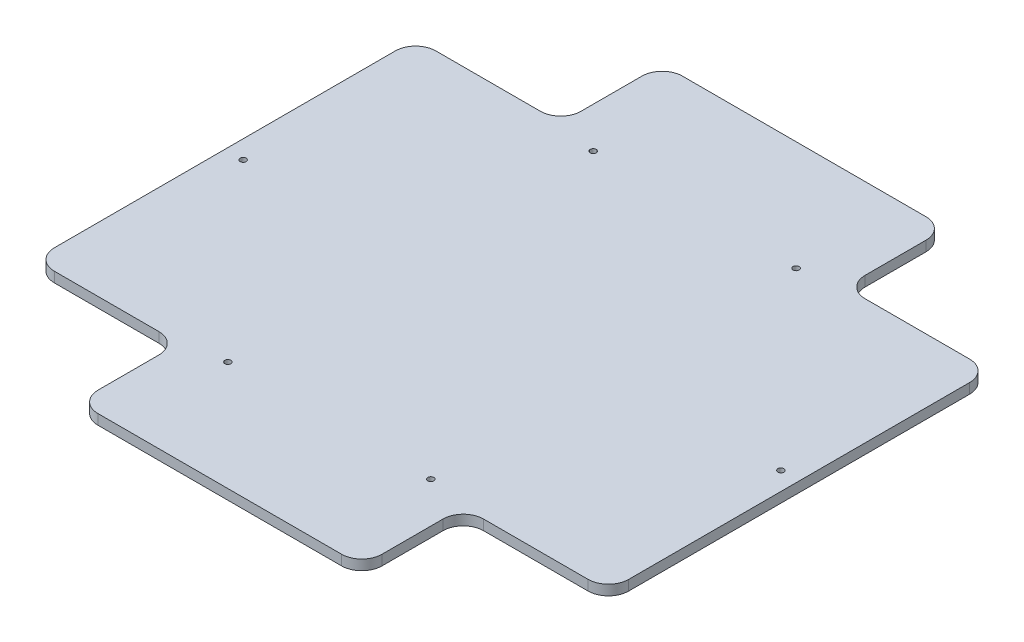
ISO-10303-21;
HEADER;
FILE_DESCRIPTION(('STEP AP214'),'2;1');
FILE_NAME('part.step','',(''),(''),'','','');
FILE_SCHEMA(('AUTOMOTIVE_DESIGN { 1 0 10303 214 1 1 1 1 }'));
ENDSEC;
DATA;
#1=APPLICATION_CONTEXT('core data for automotive mechanical design processes');
#2=APPLICATION_PROTOCOL_DEFINITION('international standard','automotive_design',2000,#1);
#3=PRODUCT_CONTEXT('',#1,'mechanical');
#4=PRODUCT('Part','Part','',(#3));
#5=PRODUCT_RELATED_PRODUCT_CATEGORY('part','',(#4));
#6=PRODUCT_DEFINITION_FORMATION('','',#4);
#7=PRODUCT_DEFINITION_CONTEXT('part definition',#1,'design');
#8=PRODUCT_DEFINITION('design','',#6,#7);
#9=PRODUCT_DEFINITION_SHAPE('','',#8);
#10=(LENGTH_UNIT() NAMED_UNIT(*) SI_UNIT(.MILLI.,.METRE.));
#11=(NAMED_UNIT(*) PLANE_ANGLE_UNIT() SI_UNIT($,.RADIAN.));
#12=(NAMED_UNIT(*) SI_UNIT($,.STERADIAN.) SOLID_ANGLE_UNIT());
#13=UNCERTAINTY_MEASURE_WITH_UNIT(LENGTH_MEASURE(1.E-05),#10,'distance_accuracy_value','');
#14=(GEOMETRIC_REPRESENTATION_CONTEXT(3) GLOBAL_UNCERTAINTY_ASSIGNED_CONTEXT((#13)) GLOBAL_UNIT_ASSIGNED_CONTEXT((#10,
#11,#12)) REPRESENTATION_CONTEXT('',''));
#15=CARTESIAN_POINT('',(0.,0.,0.));
#16=DIRECTION('',(0.,0.,1.));
#17=DIRECTION('',(1.,0.,0.));
#18=AXIS2_PLACEMENT_3D('',#15,#16,#17);
#19=CARTESIAN_POINT('',(-141.5,-5.,-94.));
#20=DIRECTION('',(0.,0.,-1.));
#21=DIRECTION('',(-1.,0.,0.));
#22=AXIS2_PLACEMENT_3D('',#19,#20,#21);
#23=PLANE('',#22);
#24=DIRECTION('',(-1.,0.,0.));
#25=VECTOR('',#24,1.);
#26=CARTESIAN_POINT('',(-141.5,5.,-94.));
#27=LINE('',#26,#25);
#28=CARTESIAN_POINT('',(-80.0000000000001,5.,-94.));
#29=VERTEX_POINT('',#28);
#30=CARTESIAN_POINT('',(-131.5,5.,-94.));
#31=VERTEX_POINT('',#30);
#32=EDGE_CURVE('E391',#29,#31,#27,.T.);
#33=ORIENTED_EDGE('',*,*,#32,.F.);
#34=DIRECTION('',(0.,1.,0.));
#35=VECTOR('',#34,1.);
#36=CARTESIAN_POINT('',(-80.0000000000001,0.,-94.));
#37=LINE('',#36,#35);
#38=CARTESIAN_POINT('',(-80.0000000000001,0.,-94.));
#39=VERTEX_POINT('',#38);
#40=EDGE_CURVE('E248',#29,#39,#37,.F.);
#41=ORIENTED_EDGE('',*,*,#40,.T.);
#42=DIRECTION('',(-1.,0.,0.));
#43=VECTOR('',#42,1.);
#44=CARTESIAN_POINT('',(0.,0.,-94.));
#45=LINE('',#44,#43);
#46=CARTESIAN_POINT('',(-131.5,0.,-94.));
#47=VERTEX_POINT('',#46);
#48=EDGE_CURVE('E222',#39,#47,#45,.T.);
#49=ORIENTED_EDGE('',*,*,#48,.T.);
#50=DIRECTION('',(0.,1.,0.));
#51=VECTOR('',#50,1.);
#52=CARTESIAN_POINT('',(-131.5,-5.,-94.));
#53=LINE('',#52,#51);
#54=EDGE_CURVE('E411',#47,#31,#53,.T.);
#55=ORIENTED_EDGE('',*,*,#54,.T.);
#56=EDGE_LOOP('',(#33,#41,#49,#55));
#57=FACE_BOUND('',#56,.T.);
#58=ADVANCED_FACE('F36',(#57),#23,.T.);
#59=CARTESIAN_POINT('',(-141.5,-5.,94.));
#60=DIRECTION('',(0.,0.,1.));
#61=DIRECTION('',(1.,0.,0.));
#62=AXIS2_PLACEMENT_3D('',#59,#60,#61);
#63=PLANE('',#62);
#64=DIRECTION('',(1.,0.,0.));
#65=VECTOR('',#64,1.);
#66=CARTESIAN_POINT('',(0.,0.,94.));
#67=LINE('',#66,#65);
#68=CARTESIAN_POINT('',(-131.5,0.,94.));
#69=VERTEX_POINT('',#68);
#70=CARTESIAN_POINT('',(-80.,0.,94.));
#71=VERTEX_POINT('',#70);
#72=EDGE_CURVE('E223',#69,#71,#67,.T.);
#73=ORIENTED_EDGE('',*,*,#72,.T.);
#74=DIRECTION('',(0.,1.,0.));
#75=VECTOR('',#74,1.);
#76=CARTESIAN_POINT('',(-80.,5.,94.));
#77=LINE('',#76,#75);
#78=CARTESIAN_POINT('',(-80.,5.,94.));
#79=VERTEX_POINT('',#78);
#80=EDGE_CURVE('E277',#71,#79,#77,.T.);
#81=ORIENTED_EDGE('',*,*,#80,.T.);
#82=DIRECTION('',(1.,0.,0.));
#83=VECTOR('',#82,1.);
#84=CARTESIAN_POINT('',(-141.5,5.,94.));
#85=LINE('',#84,#83);
#86=CARTESIAN_POINT('',(-131.5,5.,94.));
#87=VERTEX_POINT('',#86);
#88=EDGE_CURVE('E321',#87,#79,#85,.T.);
#89=ORIENTED_EDGE('',*,*,#88,.F.);
#90=DIRECTION('',(0.,1.,0.));
#91=VECTOR('',#90,1.);
#92=CARTESIAN_POINT('',(-131.5,-5.,94.));
#93=LINE('',#92,#91);
#94=EDGE_CURVE('E230',#87,#69,#93,.F.);
#95=ORIENTED_EDGE('',*,*,#94,.T.);
#96=EDGE_LOOP('',(#73,#81,#89,#95));
#97=FACE_BOUND('',#96,.T.);
#98=ADVANCED_FACE('F482',(#97),#63,.T.);
#99=CARTESIAN_POINT('',(0.,0.,0.));
#100=DIRECTION('',(0.,1.,0.));
#101=DIRECTION('',(0.,0.,1.));
#102=AXIS2_PLACEMENT_3D('',#99,#100,#101);
#103=PLANE('',#102);
#104=CARTESIAN_POINT('',(-50.,0.,90.));
#105=DIRECTION('',(0.,1.,0.));
#106=DIRECTION('',(0.,0.,1.));
#107=AXIS2_PLACEMENT_3D('',#104,#105,#106);
#108=CIRCLE('',#107,1.5);
#109=CARTESIAN_POINT('',(-50.,0.,91.5));
#110=VERTEX_POINT('',#109);
#111=EDGE_CURVE('E360',#110,#110,#108,.F.);
#112=ORIENTED_EDGE('',*,*,#111,.F.);
#113=EDGE_LOOP('',(#112));
#114=FACE_BOUND('',#113,.T.);
#115=CARTESIAN_POINT('',(50.,0.,90.));
#116=DIRECTION('',(0.,1.,0.));
#117=DIRECTION('',(0.,0.,1.));
#118=AXIS2_PLACEMENT_3D('',#115,#116,#117);
#119=CIRCLE('',#118,1.5);
#120=CARTESIAN_POINT('',(50.,0.,91.5));
#121=VERTEX_POINT('',#120);
#122=EDGE_CURVE('E355',#121,#121,#119,.F.);
#123=ORIENTED_EDGE('',*,*,#122,.F.);
#124=EDGE_LOOP('',(#123));
#125=FACE_BOUND('',#124,.T.);
#126=CARTESIAN_POINT('',(-50.,0.,-90.));
#127=DIRECTION('',(0.,1.,0.));
#128=DIRECTION('',(0.,0.,1.));
#129=AXIS2_PLACEMENT_3D('',#126,#127,#128);
#130=CIRCLE('',#129,1.5);
#131=CARTESIAN_POINT('',(-50.,0.,-88.5));
#132=VERTEX_POINT('',#131);
#133=EDGE_CURVE('E372',#132,#132,#130,.T.);
#134=ORIENTED_EDGE('',*,*,#133,.T.);
#135=EDGE_LOOP('',(#134));
#136=FACE_BOUND('',#135,.T.);
#137=CARTESIAN_POINT('',(50.,0.,-90.));
#138=DIRECTION('',(0.,1.,0.));
#139=DIRECTION('',(0.,0.,1.));
#140=AXIS2_PLACEMENT_3D('',#137,#138,#139);
#141=CIRCLE('',#140,1.5);
#142=CARTESIAN_POINT('',(50.,0.,-88.5));
#143=VERTEX_POINT('',#142);
#144=EDGE_CURVE('E367',#143,#143,#141,.T.);
#145=ORIENTED_EDGE('',*,*,#144,.T.);
#146=EDGE_LOOP('',(#145));
#147=FACE_BOUND('',#146,.T.);
#148=CARTESIAN_POINT('',(-132.5,0.,0.));
#149=DIRECTION('',(0.,1.,0.));
#150=DIRECTION('',(0.,0.,1.));
#151=AXIS2_PLACEMENT_3D('',#148,#149,#150);
#152=CIRCLE('',#151,1.5);
#153=CARTESIAN_POINT('',(-132.5,0.,1.5));
#154=VERTEX_POINT('',#153);
#155=EDGE_CURVE('E384',#154,#154,#152,.T.);
#156=ORIENTED_EDGE('',*,*,#155,.T.);
#157=EDGE_LOOP('',(#156));
#158=FACE_BOUND('',#157,.T.);
#159=CARTESIAN_POINT('',(132.5,0.,0.));
#160=DIRECTION('',(0.,1.,0.));
#161=DIRECTION('',(0.,0.,1.));
#162=AXIS2_PLACEMENT_3D('',#159,#160,#161);
#163=CIRCLE('',#162,1.5);
#164=CARTESIAN_POINT('',(132.5,0.,1.5));
#165=VERTEX_POINT('',#164);
#166=EDGE_CURVE('E379',#165,#165,#163,.T.);
#167=ORIENTED_EDGE('',*,*,#166,.T.);
#168=EDGE_LOOP('',(#167));
#169=FACE_BOUND('',#168,.T.);
#170=DIRECTION('',(0.,0.,-1.));
#171=VECTOR('',#170,1.);
#172=CARTESIAN_POINT('',(-70.0000000000001,0.,-94.));
#173=LINE('',#172,#171);
#174=CARTESIAN_POINT('',(-70.0000000000001,0.,-104.));
#175=VERTEX_POINT('',#174);
#176=CARTESIAN_POINT('',(-70.,0.,-134.));
#177=VERTEX_POINT('',#176);
#178=EDGE_CURVE('E432',#175,#177,#173,.T.);
#179=ORIENTED_EDGE('',*,*,#178,.T.);
#180=CARTESIAN_POINT('',(-60.,0.,-134.));
#181=DIRECTION('',(0.,1.,0.));
#182=DIRECTION('',(0.,0.,1.));
#183=AXIS2_PLACEMENT_3D('',#180,#181,#182);
#184=CIRCLE('',#183,10.);
#185=CARTESIAN_POINT('',(-60.,0.,-144.));
#186=VERTEX_POINT('',#185);
#187=EDGE_CURVE('E268',#177,#186,#184,.F.);
#188=ORIENTED_EDGE('',*,*,#187,.T.);
#189=DIRECTION('',(1.,0.,0.));
#190=VECTOR('',#189,1.);
#191=CARTESIAN_POINT('',(-70.,0.,-144.));
#192=LINE('',#191,#190);
#193=CARTESIAN_POINT('',(60.,0.,-144.));
#194=VERTEX_POINT('',#193);
#195=EDGE_CURVE('E439',#186,#194,#192,.T.);
#196=ORIENTED_EDGE('',*,*,#195,.T.);
#197=CARTESIAN_POINT('',(60.,0.,-134.));
#198=DIRECTION('',(0.,1.,0.));
#199=DIRECTION('',(0.,0.,1.));
#200=AXIS2_PLACEMENT_3D('',#197,#198,#199);
#201=CIRCLE('',#200,10.);
#202=CARTESIAN_POINT('',(70.,0.,-134.));
#203=VERTEX_POINT('',#202);
#204=EDGE_CURVE('E58',#194,#203,#201,.F.);
#205=ORIENTED_EDGE('',*,*,#204,.T.);
#206=DIRECTION('',(0.,0.,1.));
#207=VECTOR('',#206,1.);
#208=CARTESIAN_POINT('',(69.9999999999998,0.,-94.));
#209=LINE('',#208,#207);
#210=CARTESIAN_POINT('',(69.9999999999999,0.,-104.));
#211=VERTEX_POINT('',#210);
#212=EDGE_CURVE('E341',#203,#211,#209,.T.);
#213=ORIENTED_EDGE('',*,*,#212,.T.);
#214=CARTESIAN_POINT('',(79.9999999999998,0.,-104.));
#215=DIRECTION('',(0.,1.,0.));
#216=DIRECTION('',(0.,0.,1.));
#217=AXIS2_PLACEMENT_3D('',#214,#215,#216);
#218=CIRCLE('',#217,10.);
#219=CARTESIAN_POINT('',(79.9999999999998,0.,-94.));
#220=VERTEX_POINT('',#219);
#221=EDGE_CURVE('E303',#211,#220,#218,.T.);
#222=ORIENTED_EDGE('',*,*,#221,.T.);
#223=CARTESIAN_POINT('',(131.5,0.,-94.));
#224=VERTEX_POINT('',#223);
#225=EDGE_CURVE('E397',#224,#220,#45,.T.);
#226=ORIENTED_EDGE('',*,*,#225,.F.);
#227=CARTESIAN_POINT('',(131.5,0.,-84.));
#228=DIRECTION('',(0.,1.,0.));
#229=DIRECTION('',(0.,0.,1.));
#230=AXIS2_PLACEMENT_3D('',#227,#228,#229);
#231=CIRCLE('',#230,10.);
#232=CARTESIAN_POINT('',(141.5,0.,-84.));
#233=VERTEX_POINT('',#232);
#234=EDGE_CURVE('E221',#224,#233,#231,.F.);
#235=ORIENTED_EDGE('',*,*,#234,.T.);
#236=DIRECTION('',(0.,0.,-1.));
#237=VECTOR('',#236,1.);
#238=CARTESIAN_POINT('',(141.5,0.,0.));
#239=LINE('',#238,#237);
#240=CARTESIAN_POINT('',(141.5,0.,84.));
#241=VERTEX_POINT('',#240);
#242=EDGE_CURVE('E203',#241,#233,#239,.T.);
#243=ORIENTED_EDGE('',*,*,#242,.F.);
#244=CARTESIAN_POINT('',(131.5,0.,84.));
#245=DIRECTION('',(0.,1.,0.));
#246=DIRECTION('',(0.,0.,1.));
#247=AXIS2_PLACEMENT_3D('',#244,#245,#246);
#248=CIRCLE('',#247,10.);
#249=CARTESIAN_POINT('',(131.5,0.,94.));
#250=VERTEX_POINT('',#249);
#251=EDGE_CURVE('E217',#241,#250,#248,.F.);
#252=ORIENTED_EDGE('',*,*,#251,.T.);
#253=CARTESIAN_POINT('',(80.,0.,94.));
#254=VERTEX_POINT('',#253);
#255=EDGE_CURVE('E329',#254,#250,#67,.T.);
#256=ORIENTED_EDGE('',*,*,#255,.F.);
#257=CARTESIAN_POINT('',(80.,0.,104.));
#258=DIRECTION('',(0.,1.,0.));
#259=DIRECTION('',(0.,0.,1.));
#260=AXIS2_PLACEMENT_3D('',#257,#258,#259);
#261=CIRCLE('',#260,10.);
#262=CARTESIAN_POINT('',(70.,0.,104.));
#263=VERTEX_POINT('',#262);
#264=EDGE_CURVE('E12',#254,#263,#261,.T.);
#265=ORIENTED_EDGE('',*,*,#264,.T.);
#266=DIRECTION('',(0.,0.,1.));
#267=VECTOR('',#266,1.);
#268=CARTESIAN_POINT('',(70.,0.,94.));
#269=LINE('',#268,#267);
#270=CARTESIAN_POINT('',(70.,0.,134.));
#271=VERTEX_POINT('',#270);
#272=EDGE_CURVE('E327',#263,#271,#269,.T.);
#273=ORIENTED_EDGE('',*,*,#272,.T.);
#274=CARTESIAN_POINT('',(60.,0.,134.));
#275=DIRECTION('',(0.,1.,0.));
#276=DIRECTION('',(0.,0.,1.));
#277=AXIS2_PLACEMENT_3D('',#274,#275,#276);
#278=CIRCLE('',#277,10.);
#279=CARTESIAN_POINT('',(60.,0.,144.));
#280=VERTEX_POINT('',#279);
#281=EDGE_CURVE('E263',#271,#280,#278,.F.);
#282=ORIENTED_EDGE('',*,*,#281,.T.);
#283=DIRECTION('',(-1.,0.,0.));
#284=VECTOR('',#283,1.);
#285=CARTESIAN_POINT('',(-70.,0.,144.));
#286=LINE('',#285,#284);
#287=CARTESIAN_POINT('',(-60.,0.,144.));
#288=VERTEX_POINT('',#287);
#289=EDGE_CURVE('E336',#280,#288,#286,.T.);
#290=ORIENTED_EDGE('',*,*,#289,.T.);
#291=CARTESIAN_POINT('',(-60.,0.,134.));
#292=DIRECTION('',(0.,1.,0.));
#293=DIRECTION('',(0.,0.,1.));
#294=AXIS2_PLACEMENT_3D('',#291,#292,#293);
#295=CIRCLE('',#294,10.);
#296=CARTESIAN_POINT('',(-70.,0.,134.));
#297=VERTEX_POINT('',#296);
#298=EDGE_CURVE('E265',#288,#297,#295,.F.);
#299=ORIENTED_EDGE('',*,*,#298,.T.);
#300=DIRECTION('',(0.,0.,-1.));
#301=VECTOR('',#300,1.);
#302=CARTESIAN_POINT('',(-70.,0.,94.));
#303=LINE('',#302,#301);
#304=CARTESIAN_POINT('',(-70.,0.,104.));
#305=VERTEX_POINT('',#304);
#306=EDGE_CURVE('E333',#297,#305,#303,.T.);
#307=ORIENTED_EDGE('',*,*,#306,.T.);
#308=CARTESIAN_POINT('',(-80.,0.,104.));
#309=DIRECTION('',(0.,1.,0.));
#310=DIRECTION('',(0.,0.,1.));
#311=AXIS2_PLACEMENT_3D('',#308,#309,#310);
#312=CIRCLE('',#311,10.);
#313=EDGE_CURVE('E307',#305,#71,#312,.T.);
#314=ORIENTED_EDGE('',*,*,#313,.T.);
#315=ORIENTED_EDGE('',*,*,#72,.F.);
#316=CARTESIAN_POINT('',(-131.5,0.,84.));
#317=DIRECTION('',(0.,1.,0.));
#318=DIRECTION('',(0.,0.,1.));
#319=AXIS2_PLACEMENT_3D('',#316,#317,#318);
#320=CIRCLE('',#319,10.);
#321=CARTESIAN_POINT('',(-141.5,0.,84.));
#322=VERTEX_POINT('',#321);
#323=EDGE_CURVE('E228',#69,#322,#320,.F.);
#324=ORIENTED_EDGE('',*,*,#323,.T.);
#325=DIRECTION('',(0.,0.,1.));
#326=VECTOR('',#325,1.);
#327=CARTESIAN_POINT('',(-141.5,0.,0.));
#328=LINE('',#327,#326);
#329=CARTESIAN_POINT('',(-141.5,0.,-84.));
#330=VERTEX_POINT('',#329);
#331=EDGE_CURVE('E211',#330,#322,#328,.T.);
#332=ORIENTED_EDGE('',*,*,#331,.F.);
#333=CARTESIAN_POINT('',(-131.5,0.,-84.));
#334=DIRECTION('',(0.,1.,0.));
#335=DIRECTION('',(0.,0.,1.));
#336=AXIS2_PLACEMENT_3D('',#333,#334,#335);
#337=CIRCLE('',#336,10.);
#338=EDGE_CURVE('E232',#330,#47,#337,.F.);
#339=ORIENTED_EDGE('',*,*,#338,.T.);
#340=ORIENTED_EDGE('',*,*,#48,.F.);
#341=CARTESIAN_POINT('',(-80.0000000000001,0.,-104.));
#342=DIRECTION('',(0.,1.,0.));
#343=DIRECTION('',(0.,0.,1.));
#344=AXIS2_PLACEMENT_3D('',#341,#342,#343);
#345=CIRCLE('',#344,10.);
#346=EDGE_CURVE('E299',#39,#175,#345,.T.);
#347=ORIENTED_EDGE('',*,*,#346,.T.);
#348=EDGE_LOOP('',(#179,#188,#196,#205,#213,#222,#226,#235,#243,#252,#256,#265,#273,#282,#290,
#299,#307,#314,#315,#324,#332,#339,#340,#347));
#349=FACE_BOUND('',#348,.T.);
#350=ADVANCED_FACE('F215',(#114,#125,#136,#147,#158,#169,#349),#103,.F.);
#351=CARTESIAN_POINT('',(-141.5,-5.,-94.));
#352=DIRECTION('',(-1.,0.,0.));
#353=DIRECTION('',(0.,0.,1.));
#354=AXIS2_PLACEMENT_3D('',#351,#352,#353);
#355=PLANE('',#354);
#356=ORIENTED_EDGE('',*,*,#331,.T.);
#357=DIRECTION('',(0.,1.,0.));
#358=VECTOR('',#357,1.);
#359=CARTESIAN_POINT('',(-141.5,-5.,84.));
#360=LINE('',#359,#358);
#361=CARTESIAN_POINT('',(-141.5,5.,84.));
#362=VERTEX_POINT('',#361);
#363=EDGE_CURVE('E240',#322,#362,#360,.T.);
#364=ORIENTED_EDGE('',*,*,#363,.T.);
#365=DIRECTION('',(0.,0.,1.));
#366=VECTOR('',#365,1.);
#367=CARTESIAN_POINT('',(-141.5,5.,-94.));
#368=LINE('',#367,#366);
#369=CARTESIAN_POINT('',(-141.5,5.,-84.));
#370=VERTEX_POINT('',#369);
#371=EDGE_CURVE('E322',#370,#362,#368,.T.);
#372=ORIENTED_EDGE('',*,*,#371,.F.);
#373=DIRECTION('',(0.,1.,0.));
#374=VECTOR('',#373,1.);
#375=CARTESIAN_POINT('',(-141.5,-5.,-84.));
#376=LINE('',#375,#374);
#377=EDGE_CURVE('E238',#370,#330,#376,.F.);
#378=ORIENTED_EDGE('',*,*,#377,.T.);
#379=EDGE_LOOP('',(#356,#364,#372,#378));
#380=FACE_BOUND('',#379,.T.);
#381=ADVANCED_FACE('F492',(#380),#355,.T.);
#382=ORIENTED_EDGE('',*,*,#225,.T.);
#383=DIRECTION('',(0.,1.,0.));
#384=VECTOR('',#383,1.);
#385=CARTESIAN_POINT('',(79.9999999999998,5.,-94.));
#386=LINE('',#385,#384);
#387=CARTESIAN_POINT('',(79.9999999999998,5.,-94.));
#388=VERTEX_POINT('',#387);
#389=EDGE_CURVE('E274',#220,#388,#386,.T.);
#390=ORIENTED_EDGE('',*,*,#389,.T.);
#391=CARTESIAN_POINT('',(131.5,5.,-94.));
#392=VERTEX_POINT('',#391);
#393=EDGE_CURVE('E392',#392,#388,#27,.T.);
#394=ORIENTED_EDGE('',*,*,#393,.F.);
#395=DIRECTION('',(0.,1.,0.));
#396=VECTOR('',#395,1.);
#397=CARTESIAN_POINT('',(131.5,-5.,-94.));
#398=LINE('',#397,#396);
#399=EDGE_CURVE('E414',#392,#224,#398,.F.);
#400=ORIENTED_EDGE('',*,*,#399,.T.);
#401=EDGE_LOOP('',(#382,#390,#394,#400));
#402=FACE_BOUND('',#401,.T.);
#403=ADVANCED_FACE('F466',(#402),#23,.T.);
#404=CARTESIAN_POINT('',(141.5,-5.,-94.));
#405=DIRECTION('',(1.,0.,0.));
#406=DIRECTION('',(0.,0.,-1.));
#407=AXIS2_PLACEMENT_3D('',#404,#405,#406);
#408=PLANE('',#407);
#409=ORIENTED_EDGE('',*,*,#242,.T.);
#410=DIRECTION('',(0.,1.,0.));
#411=VECTOR('',#410,1.);
#412=CARTESIAN_POINT('',(141.5,-5.,-84.));
#413=LINE('',#412,#411);
#414=CARTESIAN_POINT('',(141.5,5.,-84.));
#415=VERTEX_POINT('',#414);
#416=EDGE_CURVE('E210',#233,#415,#413,.T.);
#417=ORIENTED_EDGE('',*,*,#416,.T.);
#418=DIRECTION('',(0.,0.,-1.));
#419=VECTOR('',#418,1.);
#420=CARTESIAN_POINT('',(141.5,5.,-94.));
#421=LINE('',#420,#419);
#422=CARTESIAN_POINT('',(141.5,5.,84.));
#423=VERTEX_POINT('',#422);
#424=EDGE_CURVE('E206',#423,#415,#421,.T.);
#425=ORIENTED_EDGE('',*,*,#424,.F.);
#426=DIRECTION('',(0.,1.,0.));
#427=VECTOR('',#426,1.);
#428=CARTESIAN_POINT('',(141.5,-5.,84.));
#429=LINE('',#428,#427);
#430=EDGE_CURVE('E199',#423,#241,#429,.F.);
#431=ORIENTED_EDGE('',*,*,#430,.T.);
#432=EDGE_LOOP('',(#409,#417,#425,#431));
#433=FACE_BOUND('',#432,.T.);
#434=ADVANCED_FACE('F201',(#433),#408,.T.);
#435=CARTESIAN_POINT('',(80.,5.,94.));
#436=VERTEX_POINT('',#435);
#437=CARTESIAN_POINT('',(131.5,5.,94.));
#438=VERTEX_POINT('',#437);
#439=EDGE_CURVE('E313',#436,#438,#85,.T.);
#440=ORIENTED_EDGE('',*,*,#439,.F.);
#441=DIRECTION('',(0.,1.,0.));
#442=VECTOR('',#441,1.);
#443=CARTESIAN_POINT('',(80.,0.,94.));
#444=LINE('',#443,#442);
#445=EDGE_CURVE('E295',#436,#254,#444,.F.);
#446=ORIENTED_EDGE('',*,*,#445,.T.);
#447=ORIENTED_EDGE('',*,*,#255,.T.);
#448=DIRECTION('',(0.,1.,0.));
#449=VECTOR('',#448,1.);
#450=CARTESIAN_POINT('',(131.5,-5.,94.));
#451=LINE('',#450,#449);
#452=EDGE_CURVE('E227',#250,#438,#451,.T.);
#453=ORIENTED_EDGE('',*,*,#452,.T.);
#454=EDGE_LOOP('',(#440,#446,#447,#453));
#455=FACE_BOUND('',#454,.T.);
#456=ADVANCED_FACE('F320',(#455),#63,.T.);
#457=CARTESIAN_POINT('',(0.,5.,0.));
#458=DIRECTION('',(0.,1.,0.));
#459=DIRECTION('',(0.,0.,1.));
#460=AXIS2_PLACEMENT_3D('',#457,#458,#459);
#461=PLANE('',#460);
#462=CARTESIAN_POINT('',(-50.,5.,90.));
#463=DIRECTION('',(0.,-1.,0.));
#464=DIRECTION('',(0.,0.,-1.));
#465=AXIS2_PLACEMENT_3D('',#462,#463,#464);
#466=CIRCLE('',#465,1.5);
#467=CARTESIAN_POINT('',(-50.,5.,88.5));
#468=VERTEX_POINT('',#467);
#469=EDGE_CURVE('E352',#468,#468,#466,.T.);
#470=ORIENTED_EDGE('',*,*,#469,.T.);
#471=EDGE_LOOP('',(#470));
#472=FACE_BOUND('',#471,.T.);
#473=CARTESIAN_POINT('',(50.,5.,90.));
#474=DIRECTION('',(0.,-1.,0.));
#475=DIRECTION('',(0.,0.,-1.));
#476=AXIS2_PLACEMENT_3D('',#473,#474,#475);
#477=CIRCLE('',#476,1.5);
#478=CARTESIAN_POINT('',(50.,5.,88.5));
#479=VERTEX_POINT('',#478);
#480=EDGE_CURVE('E351',#479,#479,#477,.T.);
#481=ORIENTED_EDGE('',*,*,#480,.T.);
#482=EDGE_LOOP('',(#481));
#483=FACE_BOUND('',#482,.T.);
#484=CARTESIAN_POINT('',(-50.,5.,-90.));
#485=DIRECTION('',(0.,1.,0.));
#486=DIRECTION('',(0.,0.,1.));
#487=AXIS2_PLACEMENT_3D('',#484,#485,#486);
#488=CIRCLE('',#487,1.5);
#489=CARTESIAN_POINT('',(-50.,5.,-88.5));
#490=VERTEX_POINT('',#489);
#491=EDGE_CURVE('E364',#490,#490,#488,.T.);
#492=ORIENTED_EDGE('',*,*,#491,.F.);
#493=EDGE_LOOP('',(#492));
#494=FACE_BOUND('',#493,.T.);
#495=CARTESIAN_POINT('',(50.,5.,-90.));
#496=DIRECTION('',(0.,1.,0.));
#497=DIRECTION('',(0.,0.,1.));
#498=AXIS2_PLACEMENT_3D('',#495,#496,#497);
#499=CIRCLE('',#498,1.5);
#500=CARTESIAN_POINT('',(50.,5.,-88.5));
#501=VERTEX_POINT('',#500);
#502=EDGE_CURVE('E363',#501,#501,#499,.T.);
#503=ORIENTED_EDGE('',*,*,#502,.F.);
#504=EDGE_LOOP('',(#503));
#505=FACE_BOUND('',#504,.T.);
#506=CARTESIAN_POINT('',(-132.5,5.,0.));
#507=DIRECTION('',(0.,1.,0.));
#508=DIRECTION('',(0.,0.,1.));
#509=AXIS2_PLACEMENT_3D('',#506,#507,#508);
#510=CIRCLE('',#509,1.5);
#511=CARTESIAN_POINT('',(-132.5,5.,1.5));
#512=VERTEX_POINT('',#511);
#513=EDGE_CURVE('E376',#512,#512,#510,.T.);
#514=ORIENTED_EDGE('',*,*,#513,.F.);
#515=EDGE_LOOP('',(#514));
#516=FACE_BOUND('',#515,.T.);
#517=CARTESIAN_POINT('',(132.5,5.,0.));
#518=DIRECTION('',(0.,1.,0.));
#519=DIRECTION('',(0.,0.,1.));
#520=AXIS2_PLACEMENT_3D('',#517,#518,#519);
#521=CIRCLE('',#520,1.5);
#522=CARTESIAN_POINT('',(132.5,5.,1.5));
#523=VERTEX_POINT('',#522);
#524=EDGE_CURVE('E375',#523,#523,#521,.T.);
#525=ORIENTED_EDGE('',*,*,#524,.F.);
#526=EDGE_LOOP('',(#525));
#527=FACE_BOUND('',#526,.T.);
#528=DIRECTION('',(-1.,0.,0.));
#529=VECTOR('',#528,1.);
#530=CARTESIAN_POINT('',(-70.,5.,-144.));
#531=LINE('',#530,#529);
#532=CARTESIAN_POINT('',(60.,5.,-144.));
#533=VERTEX_POINT('',#532);
#534=CARTESIAN_POINT('',(-60.,5.,-144.));
#535=VERTEX_POINT('',#534);
#536=EDGE_CURVE('E447',#533,#535,#531,.T.);
#537=ORIENTED_EDGE('',*,*,#536,.T.);
#538=CARTESIAN_POINT('',(-60.,5.,-134.));
#539=DIRECTION('',(0.,1.,0.));
#540=DIRECTION('',(0.,0.,1.));
#541=AXIS2_PLACEMENT_3D('',#538,#539,#540);
#542=CIRCLE('',#541,10.);
#543=CARTESIAN_POINT('',(-70.,5.,-134.));
#544=VERTEX_POINT('',#543);
#545=EDGE_CURVE('E261',#535,#544,#542,.T.);
#546=ORIENTED_EDGE('',*,*,#545,.T.);
#547=DIRECTION('',(0.,0.,1.));
#548=VECTOR('',#547,1.);
#549=CARTESIAN_POINT('',(-70.0000000000001,5.,-94.));
#550=LINE('',#549,#548);
#551=CARTESIAN_POINT('',(-70.0000000000001,5.,-104.));
#552=VERTEX_POINT('',#551);
#553=EDGE_CURVE('E441',#544,#552,#550,.T.);
#554=ORIENTED_EDGE('',*,*,#553,.T.);
#555=CARTESIAN_POINT('',(-80.0000000000001,5.,-104.));
#556=DIRECTION('',(0.,1.,0.));
#557=DIRECTION('',(0.,0.,1.));
#558=AXIS2_PLACEMENT_3D('',#555,#556,#557);
#559=CIRCLE('',#558,10.);
#560=EDGE_CURVE('E297',#552,#29,#559,.F.);
#561=ORIENTED_EDGE('',*,*,#560,.T.);
#562=ORIENTED_EDGE('',*,*,#32,.T.);
#563=CARTESIAN_POINT('',(-131.5,5.,-84.));
#564=DIRECTION('',(0.,1.,0.));
#565=DIRECTION('',(0.,0.,1.));
#566=AXIS2_PLACEMENT_3D('',#563,#564,#565);
#567=CIRCLE('',#566,10.);
#568=EDGE_CURVE('E403',#31,#370,#567,.T.);
#569=ORIENTED_EDGE('',*,*,#568,.T.);
#570=ORIENTED_EDGE('',*,*,#371,.T.);
#571=CARTESIAN_POINT('',(-131.5,5.,84.));
#572=DIRECTION('',(0.,1.,0.));
#573=DIRECTION('',(0.,0.,1.));
#574=AXIS2_PLACEMENT_3D('',#571,#572,#573);
#575=CIRCLE('',#574,10.);
#576=EDGE_CURVE('E405',#362,#87,#575,.T.);
#577=ORIENTED_EDGE('',*,*,#576,.T.);
#578=ORIENTED_EDGE('',*,*,#88,.T.);
#579=CARTESIAN_POINT('',(-80.,5.,104.));
#580=DIRECTION('',(0.,1.,0.));
#581=DIRECTION('',(0.,0.,1.));
#582=AXIS2_PLACEMENT_3D('',#579,#580,#581);
#583=CIRCLE('',#582,10.);
#584=CARTESIAN_POINT('',(-70.,5.,104.));
#585=VERTEX_POINT('',#584);
#586=EDGE_CURVE('E305',#79,#585,#583,.F.);
#587=ORIENTED_EDGE('',*,*,#586,.T.);
#588=DIRECTION('',(0.,0.,1.));
#589=VECTOR('',#588,1.);
#590=CARTESIAN_POINT('',(-70.,5.,94.));
#591=LINE('',#590,#589);
#592=CARTESIAN_POINT('',(-70.,5.,134.));
#593=VERTEX_POINT('',#592);
#594=EDGE_CURVE('E344',#585,#593,#591,.T.);
#595=ORIENTED_EDGE('',*,*,#594,.T.);
#596=CARTESIAN_POINT('',(-60.,5.,134.));
#597=DIRECTION('',(0.,1.,0.));
#598=DIRECTION('',(0.,0.,1.));
#599=AXIS2_PLACEMENT_3D('',#596,#597,#598);
#600=CIRCLE('',#599,10.);
#601=CARTESIAN_POINT('',(-60.,5.,144.));
#602=VERTEX_POINT('',#601);
#603=EDGE_CURVE('E257',#593,#602,#600,.T.);
#604=ORIENTED_EDGE('',*,*,#603,.T.);
#605=DIRECTION('',(1.,0.,0.));
#606=VECTOR('',#605,1.);
#607=CARTESIAN_POINT('',(-70.,5.,144.));
#608=LINE('',#607,#606);
#609=CARTESIAN_POINT('',(60.,5.,144.));
#610=VERTEX_POINT('',#609);
#611=EDGE_CURVE('E338',#602,#610,#608,.T.);
#612=ORIENTED_EDGE('',*,*,#611,.T.);
#613=CARTESIAN_POINT('',(60.,5.,134.));
#614=DIRECTION('',(0.,1.,0.));
#615=DIRECTION('',(0.,0.,1.));
#616=AXIS2_PLACEMENT_3D('',#613,#614,#615);
#617=CIRCLE('',#616,10.);
#618=CARTESIAN_POINT('',(70.,5.,134.));
#619=VERTEX_POINT('',#618);
#620=EDGE_CURVE('E255',#610,#619,#617,.T.);
#621=ORIENTED_EDGE('',*,*,#620,.T.);
#622=DIRECTION('',(0.,0.,-1.));
#623=VECTOR('',#622,1.);
#624=CARTESIAN_POINT('',(70.,5.,94.));
#625=LINE('',#624,#623);
#626=CARTESIAN_POINT('',(70.,5.,104.));
#627=VERTEX_POINT('',#626);
#628=EDGE_CURVE('E315',#619,#627,#625,.T.);
#629=ORIENTED_EDGE('',*,*,#628,.T.);
#630=CARTESIAN_POINT('',(80.,5.,104.));
#631=DIRECTION('',(0.,1.,0.));
#632=DIRECTION('',(0.,0.,1.));
#633=AXIS2_PLACEMENT_3D('',#630,#631,#632);
#634=CIRCLE('',#633,10.);
#635=EDGE_CURVE('E44',#627,#436,#634,.F.);
#636=ORIENTED_EDGE('',*,*,#635,.T.);
#637=ORIENTED_EDGE('',*,*,#439,.T.);
#638=CARTESIAN_POINT('',(131.5,5.,84.));
#639=DIRECTION('',(0.,1.,0.));
#640=DIRECTION('',(0.,0.,1.));
#641=AXIS2_PLACEMENT_3D('',#638,#639,#640);
#642=CIRCLE('',#641,10.);
#643=EDGE_CURVE('E407',#438,#423,#642,.T.);
#644=ORIENTED_EDGE('',*,*,#643,.T.);
#645=ORIENTED_EDGE('',*,*,#424,.T.);
#646=CARTESIAN_POINT('',(131.5,5.,-84.));
#647=DIRECTION('',(0.,1.,0.));
#648=DIRECTION('',(0.,0.,1.));
#649=AXIS2_PLACEMENT_3D('',#646,#647,#648);
#650=CIRCLE('',#649,10.);
#651=EDGE_CURVE('E409',#415,#392,#650,.T.);
#652=ORIENTED_EDGE('',*,*,#651,.T.);
#653=ORIENTED_EDGE('',*,*,#393,.T.);
#654=CARTESIAN_POINT('',(79.9999999999998,5.,-104.));
#655=DIRECTION('',(0.,1.,0.));
#656=DIRECTION('',(0.,0.,1.));
#657=AXIS2_PLACEMENT_3D('',#654,#655,#656);
#658=CIRCLE('',#657,10.);
#659=CARTESIAN_POINT('',(69.9999999999999,5.,-104.));
#660=VERTEX_POINT('',#659);
#661=EDGE_CURVE('E301',#388,#660,#658,.F.);
#662=ORIENTED_EDGE('',*,*,#661,.T.);
#663=DIRECTION('',(0.,0.,-1.));
#664=VECTOR('',#663,1.);
#665=CARTESIAN_POINT('',(69.9999999999998,5.,-94.));
#666=LINE('',#665,#664);
#667=CARTESIAN_POINT('',(70.,5.,-134.));
#668=VERTEX_POINT('',#667);
#669=EDGE_CURVE('E444',#660,#668,#666,.T.);
#670=ORIENTED_EDGE('',*,*,#669,.T.);
#671=CARTESIAN_POINT('',(60.,5.,-134.));
#672=DIRECTION('',(0.,1.,0.));
#673=DIRECTION('',(0.,0.,1.));
#674=AXIS2_PLACEMENT_3D('',#671,#672,#673);
#675=CIRCLE('',#674,10.);
#676=EDGE_CURVE('E259',#668,#533,#675,.T.);
#677=ORIENTED_EDGE('',*,*,#676,.T.);
#678=EDGE_LOOP('',(#537,#546,#554,#561,#562,#569,#570,#577,#578,#587,#595,#604,#612,#621,#629,
#636,#637,#644,#645,#652,#653,#662,#670,#677));
#679=FACE_BOUND('',#678,.T.);
#680=ADVANCED_FACE('F312',(#472,#483,#494,#505,#516,#527,#679),#461,.T.);
#681=CARTESIAN_POINT('',(131.5,-5.,-84.));
#682=DIRECTION('',(0.,1.,0.));
#683=DIRECTION('',(0.,0.,1.));
#684=AXIS2_PLACEMENT_3D('',#681,#682,#683);
#685=CYLINDRICAL_SURFACE('',#684,10.);
#686=ORIENTED_EDGE('',*,*,#234,.F.);
#687=ORIENTED_EDGE('',*,*,#399,.F.);
#688=ORIENTED_EDGE('',*,*,#651,.F.);
#689=ORIENTED_EDGE('',*,*,#416,.F.);
#690=EDGE_LOOP('',(#686,#687,#688,#689));
#691=FACE_BOUND('',#690,.T.);
#692=ADVANCED_FACE('F469',(#691),#685,.T.);
#693=CARTESIAN_POINT('',(131.5,-5.,84.));
#694=DIRECTION('',(0.,1.,0.));
#695=DIRECTION('',(0.,0.,1.));
#696=AXIS2_PLACEMENT_3D('',#693,#694,#695);
#697=CYLINDRICAL_SURFACE('',#696,10.);
#698=ORIENTED_EDGE('',*,*,#251,.F.);
#699=ORIENTED_EDGE('',*,*,#430,.F.);
#700=ORIENTED_EDGE('',*,*,#643,.F.);
#701=ORIENTED_EDGE('',*,*,#452,.F.);
#702=EDGE_LOOP('',(#698,#699,#700,#701));
#703=FACE_BOUND('',#702,.T.);
#704=ADVANCED_FACE('F225',(#703),#697,.T.);
#705=CARTESIAN_POINT('',(-131.5,-5.,84.));
#706=DIRECTION('',(0.,1.,0.));
#707=DIRECTION('',(0.,0.,1.));
#708=AXIS2_PLACEMENT_3D('',#705,#706,#707);
#709=CYLINDRICAL_SURFACE('',#708,10.);
#710=ORIENTED_EDGE('',*,*,#323,.F.);
#711=ORIENTED_EDGE('',*,*,#94,.F.);
#712=ORIENTED_EDGE('',*,*,#576,.F.);
#713=ORIENTED_EDGE('',*,*,#363,.F.);
#714=EDGE_LOOP('',(#710,#711,#712,#713));
#715=FACE_BOUND('',#714,.T.);
#716=ADVANCED_FACE('F476',(#715),#709,.T.);
#717=CARTESIAN_POINT('',(-131.5,-5.,-84.));
#718=DIRECTION('',(0.,1.,0.));
#719=DIRECTION('',(0.,0.,1.));
#720=AXIS2_PLACEMENT_3D('',#717,#718,#719);
#721=CYLINDRICAL_SURFACE('',#720,10.);
#722=ORIENTED_EDGE('',*,*,#338,.F.);
#723=ORIENTED_EDGE('',*,*,#377,.F.);
#724=ORIENTED_EDGE('',*,*,#568,.F.);
#725=ORIENTED_EDGE('',*,*,#54,.F.);
#726=EDGE_LOOP('',(#722,#723,#724,#725));
#727=FACE_BOUND('',#726,.T.);
#728=ADVANCED_FACE('F424',(#727),#721,.T.);
#729=CARTESIAN_POINT('',(132.5,-195.,0.));
#730=DIRECTION('',(0.,1.,0.));
#731=DIRECTION('',(0.,0.,1.));
#732=AXIS2_PLACEMENT_3D('',#729,#730,#731);
#733=CYLINDRICAL_SURFACE('',#732,1.5);
#734=ORIENTED_EDGE('',*,*,#524,.T.);
#735=EDGE_LOOP('',(#734));
#736=FACE_BOUND('',#735,.T.);
#737=ORIENTED_EDGE('',*,*,#166,.F.);
#738=EDGE_LOOP('',(#737));
#739=FACE_BOUND('',#738,.T.);
#740=ADVANCED_FACE('F642',(#736,#739),#733,.F.);
#741=CARTESIAN_POINT('',(-132.5,-195.,0.));
#742=DIRECTION('',(0.,1.,0.));
#743=DIRECTION('',(0.,0.,1.));
#744=AXIS2_PLACEMENT_3D('',#741,#742,#743);
#745=CYLINDRICAL_SURFACE('',#744,1.5);
#746=ORIENTED_EDGE('',*,*,#513,.T.);
#747=EDGE_LOOP('',(#746));
#748=FACE_BOUND('',#747,.T.);
#749=ORIENTED_EDGE('',*,*,#155,.F.);
#750=EDGE_LOOP('',(#749));
#751=FACE_BOUND('',#750,.T.);
#752=ADVANCED_FACE('F676',(#748,#751),#745,.F.);
#753=CARTESIAN_POINT('',(50.,-195.,-90.));
#754=DIRECTION('',(0.,1.,0.));
#755=DIRECTION('',(0.,0.,1.));
#756=AXIS2_PLACEMENT_3D('',#753,#754,#755);
#757=CYLINDRICAL_SURFACE('',#756,1.5);
#758=ORIENTED_EDGE('',*,*,#502,.T.);
#759=EDGE_LOOP('',(#758));
#760=FACE_BOUND('',#759,.T.);
#761=ORIENTED_EDGE('',*,*,#144,.F.);
#762=EDGE_LOOP('',(#761));
#763=FACE_BOUND('',#762,.T.);
#764=ADVANCED_FACE('F683',(#760,#763),#757,.F.);
#765=CARTESIAN_POINT('',(-50.,-195.,-90.));
#766=DIRECTION('',(0.,1.,0.));
#767=DIRECTION('',(0.,0.,1.));
#768=AXIS2_PLACEMENT_3D('',#765,#766,#767);
#769=CYLINDRICAL_SURFACE('',#768,1.5);
#770=ORIENTED_EDGE('',*,*,#491,.T.);
#771=EDGE_LOOP('',(#770));
#772=FACE_BOUND('',#771,.T.);
#773=ORIENTED_EDGE('',*,*,#133,.F.);
#774=EDGE_LOOP('',(#773));
#775=FACE_BOUND('',#774,.T.);
#776=ADVANCED_FACE('F691',(#772,#775),#769,.F.);
#777=CARTESIAN_POINT('',(50.,-195.,90.));
#778=DIRECTION('',(0.,1.,0.));
#779=DIRECTION('',(0.,0.,1.));
#780=AXIS2_PLACEMENT_3D('',#777,#778,#779);
#781=CYLINDRICAL_SURFACE('',#780,1.5);
#782=ORIENTED_EDGE('',*,*,#480,.F.);
#783=EDGE_LOOP('',(#782));
#784=FACE_BOUND('',#783,.T.);
#785=ORIENTED_EDGE('',*,*,#122,.T.);
#786=EDGE_LOOP('',(#785));
#787=FACE_BOUND('',#786,.T.);
#788=ADVANCED_FACE('F699',(#784,#787),#781,.F.);
#789=CARTESIAN_POINT('',(-50.,-195.,90.));
#790=DIRECTION('',(0.,1.,0.));
#791=DIRECTION('',(0.,0.,1.));
#792=AXIS2_PLACEMENT_3D('',#789,#790,#791);
#793=CYLINDRICAL_SURFACE('',#792,1.5);
#794=ORIENTED_EDGE('',*,*,#469,.F.);
#795=EDGE_LOOP('',(#794));
#796=FACE_BOUND('',#795,.T.);
#797=ORIENTED_EDGE('',*,*,#111,.T.);
#798=EDGE_LOOP('',(#797));
#799=FACE_BOUND('',#798,.T.);
#800=ADVANCED_FACE('F523',(#796,#799),#793,.F.);
#801=CARTESIAN_POINT('',(-70.,-148.660687473185,94.));
#802=DIRECTION('',(-1.,0.,0.));
#803=DIRECTION('',(0.,0.,1.));
#804=AXIS2_PLACEMENT_3D('',#801,#802,#803);
#805=PLANE('',#804);
#806=ORIENTED_EDGE('',*,*,#594,.F.);
#807=DIRECTION('',(0.,1.,0.));
#808=VECTOR('',#807,1.);
#809=CARTESIAN_POINT('',(-70.,0.,104.));
#810=LINE('',#809,#808);
#811=EDGE_CURVE('E283',#585,#305,#810,.F.);
#812=ORIENTED_EDGE('',*,*,#811,.T.);
#813=ORIENTED_EDGE('',*,*,#306,.F.);
#814=DIRECTION('',(0.,1.,0.));
#815=VECTOR('',#814,1.);
#816=CARTESIAN_POINT('',(-70.,-148.660687473185,134.));
#817=LINE('',#816,#815);
#818=EDGE_CURVE('E280',#297,#593,#817,.T.);
#819=ORIENTED_EDGE('',*,*,#818,.T.);
#820=EDGE_LOOP('',(#806,#812,#813,#819));
#821=FACE_BOUND('',#820,.T.);
#822=ADVANCED_FACE('F519',(#821),#805,.T.);
#823=CARTESIAN_POINT('',(70.,-148.660687473185,94.));
#824=DIRECTION('',(1.,0.,0.));
#825=DIRECTION('',(0.,0.,-1.));
#826=AXIS2_PLACEMENT_3D('',#823,#824,#825);
#827=PLANE('',#826);
#828=ORIENTED_EDGE('',*,*,#628,.F.);
#829=DIRECTION('',(0.,1.,0.));
#830=VECTOR('',#829,1.);
#831=CARTESIAN_POINT('',(70.,-148.660687473185,134.));
#832=LINE('',#831,#830);
#833=EDGE_CURVE('E293',#619,#271,#832,.F.);
#834=ORIENTED_EDGE('',*,*,#833,.T.);
#835=ORIENTED_EDGE('',*,*,#272,.F.);
#836=DIRECTION('',(0.,1.,0.));
#837=VECTOR('',#836,1.);
#838=CARTESIAN_POINT('',(70.,5.,104.));
#839=LINE('',#838,#837);
#840=EDGE_CURVE('E290',#263,#627,#839,.T.);
#841=ORIENTED_EDGE('',*,*,#840,.T.);
#842=EDGE_LOOP('',(#828,#834,#835,#841));
#843=FACE_BOUND('',#842,.T.);
#844=ADVANCED_FACE('F331',(#843),#827,.T.);
#845=CARTESIAN_POINT('',(-70.,-148.660687473185,144.));
#846=DIRECTION('',(0.,0.,1.));
#847=DIRECTION('',(1.,0.,0.));
#848=AXIS2_PLACEMENT_3D('',#845,#846,#847);
#849=PLANE('',#848);
#850=ORIENTED_EDGE('',*,*,#611,.F.);
#851=DIRECTION('',(0.,1.,0.));
#852=VECTOR('',#851,1.);
#853=CARTESIAN_POINT('',(-60.,-148.660687473185,144.));
#854=LINE('',#853,#852);
#855=EDGE_CURVE('E288',#602,#288,#854,.F.);
#856=ORIENTED_EDGE('',*,*,#855,.T.);
#857=ORIENTED_EDGE('',*,*,#289,.F.);
#858=DIRECTION('',(0.,1.,0.));
#859=VECTOR('',#858,1.);
#860=CARTESIAN_POINT('',(60.,-148.660687473185,144.));
#861=LINE('',#860,#859);
#862=EDGE_CURVE('E285',#280,#610,#861,.T.);
#863=ORIENTED_EDGE('',*,*,#862,.T.);
#864=EDGE_LOOP('',(#850,#856,#857,#863));
#865=FACE_BOUND('',#864,.T.);
#866=ADVANCED_FACE('F534',(#865),#849,.T.);
#867=CARTESIAN_POINT('',(-70.0000000000001,-148.660687473185,-94.));
#868=DIRECTION('',(-1.,0.,0.));
#869=DIRECTION('',(0.,0.,1.));
#870=AXIS2_PLACEMENT_3D('',#867,#868,#869);
#871=PLANE('',#870);
#872=ORIENTED_EDGE('',*,*,#178,.F.);
#873=DIRECTION('',(0.,1.,0.));
#874=VECTOR('',#873,1.);
#875=CARTESIAN_POINT('',(-70.0000000000001,5.,-104.));
#876=LINE('',#875,#874);
#877=EDGE_CURVE('E245',#175,#552,#876,.T.);
#878=ORIENTED_EDGE('',*,*,#877,.T.);
#879=ORIENTED_EDGE('',*,*,#553,.F.);
#880=DIRECTION('',(0.,1.,0.));
#881=VECTOR('',#880,1.);
#882=CARTESIAN_POINT('',(-70.,-148.660687473185,-134.));
#883=LINE('',#882,#881);
#884=EDGE_CURVE('E243',#544,#177,#883,.F.);
#885=ORIENTED_EDGE('',*,*,#884,.T.);
#886=EDGE_LOOP('',(#872,#878,#879,#885));
#887=FACE_BOUND('',#886,.T.);
#888=ADVANCED_FACE('F435',(#887),#871,.T.);
#889=CARTESIAN_POINT('',(-70.,-148.660687473185,-144.));
#890=DIRECTION('',(0.,0.,-1.));
#891=DIRECTION('',(-1.,0.,0.));
#892=AXIS2_PLACEMENT_3D('',#889,#890,#891);
#893=PLANE('',#892);
#894=ORIENTED_EDGE('',*,*,#195,.F.);
#895=DIRECTION('',(0.,1.,0.));
#896=VECTOR('',#895,1.);
#897=CARTESIAN_POINT('',(-60.,-148.660687473185,-144.));
#898=LINE('',#897,#896);
#899=EDGE_CURVE('E252',#186,#535,#898,.T.);
#900=ORIENTED_EDGE('',*,*,#899,.T.);
#901=ORIENTED_EDGE('',*,*,#536,.F.);
#902=DIRECTION('',(0.,1.,0.));
#903=VECTOR('',#902,1.);
#904=CARTESIAN_POINT('',(60.,-148.660687473185,-144.));
#905=LINE('',#904,#903);
#906=EDGE_CURVE('E250',#533,#194,#905,.F.);
#907=ORIENTED_EDGE('',*,*,#906,.T.);
#908=EDGE_LOOP('',(#894,#900,#901,#907));
#909=FACE_BOUND('',#908,.T.);
#910=ADVANCED_FACE('F453',(#909),#893,.T.);
#911=CARTESIAN_POINT('',(69.9999999999998,-148.660687473185,-94.));
#912=DIRECTION('',(1.,0.,0.));
#913=DIRECTION('',(0.,0.,-1.));
#914=AXIS2_PLACEMENT_3D('',#911,#912,#913);
#915=PLANE('',#914);
#916=ORIENTED_EDGE('',*,*,#212,.F.);
#917=DIRECTION('',(0.,1.,0.));
#918=VECTOR('',#917,1.);
#919=CARTESIAN_POINT('',(70.,-148.660687473185,-134.));
#920=LINE('',#919,#918);
#921=EDGE_CURVE('E271',#203,#668,#920,.T.);
#922=ORIENTED_EDGE('',*,*,#921,.T.);
#923=ORIENTED_EDGE('',*,*,#669,.F.);
#924=DIRECTION('',(0.,1.,0.));
#925=VECTOR('',#924,1.);
#926=CARTESIAN_POINT('',(69.9999999999999,0.,-104.));
#927=LINE('',#926,#925);
#928=EDGE_CURVE('E51',#660,#211,#927,.F.);
#929=ORIENTED_EDGE('',*,*,#928,.T.);
#930=EDGE_LOOP('',(#916,#922,#923,#929));
#931=FACE_BOUND('',#930,.T.);
#932=ADVANCED_FACE('F459',(#931),#915,.T.);
#933=CARTESIAN_POINT('',(-80.0000000000001,-148.660687473185,-104.));
#934=DIRECTION('',(0.,-1.,0.));
#935=DIRECTION('',(0.,0.,-1.));
#936=AXIS2_PLACEMENT_3D('',#933,#934,#935);
#937=CYLINDRICAL_SURFACE('',#936,10.);
#938=ORIENTED_EDGE('',*,*,#346,.F.);
#939=ORIENTED_EDGE('',*,*,#40,.F.);
#940=ORIENTED_EDGE('',*,*,#560,.F.);
#941=ORIENTED_EDGE('',*,*,#877,.F.);
#942=EDGE_LOOP('',(#938,#939,#940,#941));
#943=FACE_BOUND('',#942,.T.);
#944=ADVANCED_FACE('F429',(#943),#937,.F.);
#945=CARTESIAN_POINT('',(-60.,-148.660687473185,-134.));
#946=DIRECTION('',(0.,1.,0.));
#947=DIRECTION('',(0.,0.,1.));
#948=AXIS2_PLACEMENT_3D('',#945,#946,#947);
#949=CYLINDRICAL_SURFACE('',#948,10.);
#950=ORIENTED_EDGE('',*,*,#187,.F.);
#951=ORIENTED_EDGE('',*,*,#884,.F.);
#952=ORIENTED_EDGE('',*,*,#545,.F.);
#953=ORIENTED_EDGE('',*,*,#899,.F.);
#954=EDGE_LOOP('',(#950,#951,#952,#953));
#955=FACE_BOUND('',#954,.T.);
#956=ADVANCED_FACE('F449',(#955),#949,.T.);
#957=CARTESIAN_POINT('',(60.,-148.660687473185,-134.));
#958=DIRECTION('',(0.,1.,0.));
#959=DIRECTION('',(0.,0.,1.));
#960=AXIS2_PLACEMENT_3D('',#957,#958,#959);
#961=CYLINDRICAL_SURFACE('',#960,10.);
#962=ORIENTED_EDGE('',*,*,#204,.F.);
#963=ORIENTED_EDGE('',*,*,#906,.F.);
#964=ORIENTED_EDGE('',*,*,#676,.F.);
#965=ORIENTED_EDGE('',*,*,#921,.F.);
#966=EDGE_LOOP('',(#962,#963,#964,#965));
#967=FACE_BOUND('',#966,.T.);
#968=ADVANCED_FACE('F457',(#967),#961,.T.);
#969=CARTESIAN_POINT('',(79.9999999999998,-5.,-104.));
#970=DIRECTION('',(0.,-1.,0.));
#971=DIRECTION('',(0.,0.,-1.));
#972=AXIS2_PLACEMENT_3D('',#969,#970,#971);
#973=CYLINDRICAL_SURFACE('',#972,10.);
#974=ORIENTED_EDGE('',*,*,#221,.F.);
#975=ORIENTED_EDGE('',*,*,#928,.F.);
#976=ORIENTED_EDGE('',*,*,#661,.F.);
#977=ORIENTED_EDGE('',*,*,#389,.F.);
#978=EDGE_LOOP('',(#974,#975,#976,#977));
#979=FACE_BOUND('',#978,.T.);
#980=ADVANCED_FACE('F464',(#979),#973,.F.);
#981=CARTESIAN_POINT('',(-80.,-5.,104.));
#982=DIRECTION('',(0.,-1.,0.));
#983=DIRECTION('',(0.,0.,-1.));
#984=AXIS2_PLACEMENT_3D('',#981,#982,#983);
#985=CYLINDRICAL_SURFACE('',#984,10.);
#986=ORIENTED_EDGE('',*,*,#313,.F.);
#987=ORIENTED_EDGE('',*,*,#811,.F.);
#988=ORIENTED_EDGE('',*,*,#586,.F.);
#989=ORIENTED_EDGE('',*,*,#80,.F.);
#990=EDGE_LOOP('',(#986,#987,#988,#989));
#991=FACE_BOUND('',#990,.T.);
#992=ADVANCED_FACE('F600',(#991),#985,.F.);
#993=CARTESIAN_POINT('',(-60.,-148.660687473185,134.));
#994=DIRECTION('',(0.,1.,0.));
#995=DIRECTION('',(0.,0.,1.));
#996=AXIS2_PLACEMENT_3D('',#993,#994,#995);
#997=CYLINDRICAL_SURFACE('',#996,10.);
#998=ORIENTED_EDGE('',*,*,#298,.F.);
#999=ORIENTED_EDGE('',*,*,#855,.F.);
#1000=ORIENTED_EDGE('',*,*,#603,.F.);
#1001=ORIENTED_EDGE('',*,*,#818,.F.);
#1002=EDGE_LOOP('',(#998,#999,#1000,#1001));
#1003=FACE_BOUND('',#1002,.T.);
#1004=ADVANCED_FACE('F609',(#1003),#997,.T.);
#1005=CARTESIAN_POINT('',(60.,-148.660687473185,134.));
#1006=DIRECTION('',(0.,1.,0.));
#1007=DIRECTION('',(0.,0.,1.));
#1008=AXIS2_PLACEMENT_3D('',#1005,#1006,#1007);
#1009=CYLINDRICAL_SURFACE('',#1008,10.);
#1010=ORIENTED_EDGE('',*,*,#281,.F.);
#1011=ORIENTED_EDGE('',*,*,#833,.F.);
#1012=ORIENTED_EDGE('',*,*,#620,.F.);
#1013=ORIENTED_EDGE('',*,*,#862,.F.);
#1014=EDGE_LOOP('',(#1010,#1011,#1012,#1013));
#1015=FACE_BOUND('',#1014,.T.);
#1016=ADVANCED_FACE('F619',(#1015),#1009,.T.);
#1017=CARTESIAN_POINT('',(80.,-148.660687473185,104.));
#1018=DIRECTION('',(0.,-1.,0.));
#1019=DIRECTION('',(0.,0.,-1.));
#1020=AXIS2_PLACEMENT_3D('',#1017,#1018,#1019);
#1021=CYLINDRICAL_SURFACE('',#1020,10.);
#1022=ORIENTED_EDGE('',*,*,#264,.F.);
#1023=ORIENTED_EDGE('',*,*,#445,.F.);
#1024=ORIENTED_EDGE('',*,*,#635,.F.);
#1025=ORIENTED_EDGE('',*,*,#840,.F.);
#1026=EDGE_LOOP('',(#1022,#1023,#1024,#1025));
#1027=FACE_BOUND('',#1026,.T.);
#1028=ADVANCED_FACE('F38',(#1027),#1021,.F.);
#1029=CLOSED_SHELL('',(#58,#98,#350,#381,#403,#434,#456,#680,#692,#704,#716,#728,#740,#752,#764,
#776,#788,#800,#822,#844,#866,#888,#910,#932,#944,#956,#968,#980,#992,#1004,#1016,#1028));
#1030=MANIFOLD_SOLID_BREP('B2',#1029);
#1031=ADVANCED_BREP_SHAPE_REPRESENTATION('',(#18,#1030),#14);
#1032=SHAPE_DEFINITION_REPRESENTATION(#9,#1031);
ENDSEC;
END-ISO-10303-21;
